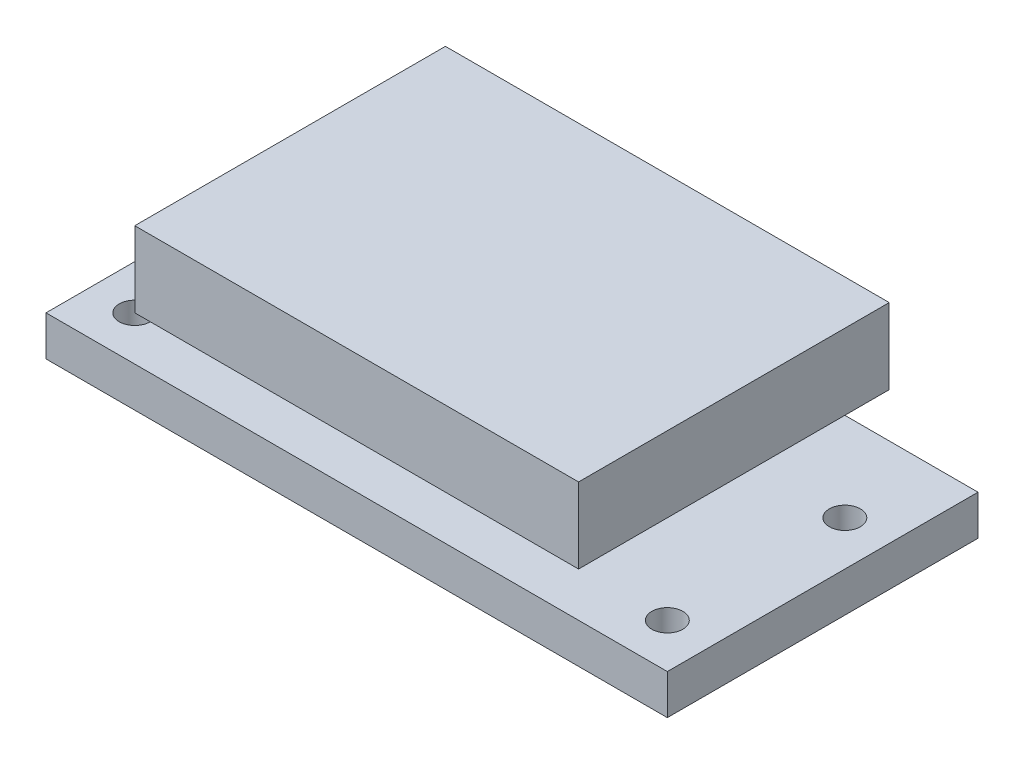
ISO-10303-21;
HEADER;
FILE_DESCRIPTION(('STEP AP214'),'2;1');
FILE_NAME('part.step','',(''),(''),'','','');
FILE_SCHEMA(('AUTOMOTIVE_DESIGN { 1 0 10303 214 1 1 1 1 }'));
ENDSEC;
DATA;
#1=APPLICATION_CONTEXT('core data for automotive mechanical design processes');
#2=APPLICATION_PROTOCOL_DEFINITION('international standard','automotive_design',2000,#1);
#3=PRODUCT_CONTEXT('',#1,'mechanical');
#4=PRODUCT('Part','Part','',(#3));
#5=PRODUCT_RELATED_PRODUCT_CATEGORY('part','',(#4));
#6=PRODUCT_DEFINITION_FORMATION('','',#4);
#7=PRODUCT_DEFINITION_CONTEXT('part definition',#1,'design');
#8=PRODUCT_DEFINITION('design','',#6,#7);
#9=PRODUCT_DEFINITION_SHAPE('','',#8);
#10=(LENGTH_UNIT() NAMED_UNIT(*) SI_UNIT(.MILLI.,.METRE.));
#11=(NAMED_UNIT(*) PLANE_ANGLE_UNIT() SI_UNIT($,.RADIAN.));
#12=(NAMED_UNIT(*) SI_UNIT($,.STERADIAN.) SOLID_ANGLE_UNIT());
#13=UNCERTAINTY_MEASURE_WITH_UNIT(LENGTH_MEASURE(1.E-05),#10,'distance_accuracy_value','');
#14=(GEOMETRIC_REPRESENTATION_CONTEXT(3) GLOBAL_UNCERTAINTY_ASSIGNED_CONTEXT((#13)) GLOBAL_UNIT_ASSIGNED_CONTEXT((#10,
#11,#12)) REPRESENTATION_CONTEXT('',''));
#15=CARTESIAN_POINT('',(0.,0.,0.));
#16=DIRECTION('',(0.,0.,1.));
#17=DIRECTION('',(1.,0.,0.));
#18=AXIS2_PLACEMENT_3D('',#15,#16,#17);
#19=CARTESIAN_POINT('',(25.,18.,-17.5));
#20=DIRECTION('',(-1.,0.,0.));
#21=DIRECTION('',(0.,0.,1.));
#22=AXIS2_PLACEMENT_3D('',#19,#20,#21);
#23=PLANE('',#22);
#24=DIRECTION('',(0.,0.,-1.));
#25=VECTOR('',#24,1.);
#26=CARTESIAN_POINT('',(25.,9.5,-17.5));
#27=LINE('',#26,#25);
#28=CARTESIAN_POINT('',(25.,9.5,17.5));
#29=VERTEX_POINT('',#28);
#30=CARTESIAN_POINT('',(25.,9.5,-17.5));
#31=VERTEX_POINT('',#30);
#32=EDGE_CURVE('E121',#29,#31,#27,.T.);
#33=ORIENTED_EDGE('',*,*,#32,.T.);
#34=DIRECTION('',(0.,-1.,0.));
#35=VECTOR('',#34,1.);
#36=CARTESIAN_POINT('',(25.,18.,-17.5));
#37=LINE('',#36,#35);
#38=CARTESIAN_POINT('',(25.,18.,-17.5));
#39=VERTEX_POINT('',#38);
#40=EDGE_CURVE('E12',#39,#31,#37,.T.);
#41=ORIENTED_EDGE('',*,*,#40,.F.);
#42=DIRECTION('',(0.,0.,-1.));
#43=VECTOR('',#42,1.);
#44=CARTESIAN_POINT('',(25.,18.,-17.5));
#45=LINE('',#44,#43);
#46=CARTESIAN_POINT('',(25.,18.,17.5));
#47=VERTEX_POINT('',#46);
#48=EDGE_CURVE('E105',#47,#39,#45,.T.);
#49=ORIENTED_EDGE('',*,*,#48,.F.);
#50=DIRECTION('',(0.,-1.,0.));
#51=VECTOR('',#50,1.);
#52=CARTESIAN_POINT('',(25.,18.,17.5));
#53=LINE('',#52,#51);
#54=EDGE_CURVE('E117',#47,#29,#53,.T.);
#55=ORIENTED_EDGE('',*,*,#54,.T.);
#56=EDGE_LOOP('',(#33,#41,#49,#55));
#57=FACE_BOUND('',#56,.T.);
#58=ADVANCED_FACE('F53',(#57),#23,.F.);
#59=CARTESIAN_POINT('',(-25.,18.,-17.5));
#60=DIRECTION('',(0.,0.,1.));
#61=DIRECTION('',(1.,0.,0.));
#62=AXIS2_PLACEMENT_3D('',#59,#60,#61);
#63=PLANE('',#62);
#64=DIRECTION('',(-1.,0.,0.));
#65=VECTOR('',#64,1.);
#66=CARTESIAN_POINT('',(-25.,9.5,-17.5));
#67=LINE('',#66,#65);
#68=CARTESIAN_POINT('',(-25.,9.5,-17.5));
#69=VERTEX_POINT('',#68);
#70=EDGE_CURVE('E110',#31,#69,#67,.T.);
#71=ORIENTED_EDGE('',*,*,#70,.T.);
#72=DIRECTION('',(0.,-1.,0.));
#73=VECTOR('',#72,1.);
#74=CARTESIAN_POINT('',(-25.,18.,-17.5));
#75=LINE('',#74,#73);
#76=CARTESIAN_POINT('',(-25.,18.,-17.5));
#77=VERTEX_POINT('',#76);
#78=EDGE_CURVE('E62',#77,#69,#75,.T.);
#79=ORIENTED_EDGE('',*,*,#78,.F.);
#80=DIRECTION('',(-1.,0.,0.));
#81=VECTOR('',#80,1.);
#82=CARTESIAN_POINT('',(-25.,18.,-17.5));
#83=LINE('',#82,#81);
#84=EDGE_CURVE('E100',#39,#77,#83,.T.);
#85=ORIENTED_EDGE('',*,*,#84,.F.);
#86=ORIENTED_EDGE('',*,*,#40,.T.);
#87=EDGE_LOOP('',(#71,#79,#85,#86));
#88=FACE_BOUND('',#87,.T.);
#89=ADVANCED_FACE('F109',(#88),#63,.F.);
#90=CARTESIAN_POINT('',(-25.,18.,-17.5));
#91=DIRECTION('',(1.,0.,0.));
#92=DIRECTION('',(0.,0.,-1.));
#93=AXIS2_PLACEMENT_3D('',#90,#91,#92);
#94=PLANE('',#93);
#95=DIRECTION('',(0.,0.,1.));
#96=VECTOR('',#95,1.);
#97=CARTESIAN_POINT('',(-25.,9.5,-17.5));
#98=LINE('',#97,#96);
#99=CARTESIAN_POINT('',(-25.,9.5,17.5));
#100=VERTEX_POINT('',#99);
#101=EDGE_CURVE('E87',#69,#100,#98,.T.);
#102=ORIENTED_EDGE('',*,*,#101,.T.);
#103=DIRECTION('',(0.,-1.,0.));
#104=VECTOR('',#103,1.);
#105=CARTESIAN_POINT('',(-25.,18.,17.5));
#106=LINE('',#105,#104);
#107=CARTESIAN_POINT('',(-25.,18.,17.5));
#108=VERTEX_POINT('',#107);
#109=EDGE_CURVE('E112',#108,#100,#106,.T.);
#110=ORIENTED_EDGE('',*,*,#109,.F.);
#111=DIRECTION('',(0.,0.,1.));
#112=VECTOR('',#111,1.);
#113=CARTESIAN_POINT('',(-25.,18.,-17.5));
#114=LINE('',#113,#112);
#115=EDGE_CURVE('E103',#77,#108,#114,.T.);
#116=ORIENTED_EDGE('',*,*,#115,.F.);
#117=ORIENTED_EDGE('',*,*,#78,.T.);
#118=EDGE_LOOP('',(#102,#110,#116,#117));
#119=FACE_BOUND('',#118,.T.);
#120=ADVANCED_FACE('F113',(#119),#94,.F.);
#121=CARTESIAN_POINT('',(-25.,18.,17.5));
#122=DIRECTION('',(0.,0.,-1.));
#123=DIRECTION('',(-1.,0.,0.));
#124=AXIS2_PLACEMENT_3D('',#121,#122,#123);
#125=PLANE('',#124);
#126=DIRECTION('',(1.,0.,0.));
#127=VECTOR('',#126,1.);
#128=CARTESIAN_POINT('',(-25.,9.5,17.5));
#129=LINE('',#128,#127);
#130=EDGE_CURVE('E93',#100,#29,#129,.T.);
#131=ORIENTED_EDGE('',*,*,#130,.T.);
#132=ORIENTED_EDGE('',*,*,#54,.F.);
#133=DIRECTION('',(1.,0.,0.));
#134=VECTOR('',#133,1.);
#135=CARTESIAN_POINT('',(-25.,18.,17.5));
#136=LINE('',#135,#134);
#137=EDGE_CURVE('E70',#108,#47,#136,.T.);
#138=ORIENTED_EDGE('',*,*,#137,.F.);
#139=ORIENTED_EDGE('',*,*,#109,.T.);
#140=EDGE_LOOP('',(#131,#132,#138,#139));
#141=FACE_BOUND('',#140,.T.);
#142=ADVANCED_FACE('F134',(#141),#125,.F.);
#143=CARTESIAN_POINT('',(0.,18.,0.));
#144=DIRECTION('',(0.,1.,0.));
#145=DIRECTION('',(0.,0.,1.));
#146=AXIS2_PLACEMENT_3D('',#143,#144,#145);
#147=PLANE('',#146);
#148=ORIENTED_EDGE('',*,*,#48,.T.);
#149=ORIENTED_EDGE('',*,*,#84,.T.);
#150=ORIENTED_EDGE('',*,*,#115,.T.);
#151=ORIENTED_EDGE('',*,*,#137,.T.);
#152=EDGE_LOOP('',(#148,#149,#150,#151));
#153=FACE_BOUND('',#152,.T.);
#154=ADVANCED_FACE('F101',(#153),#147,.T.);
#155=CARTESIAN_POINT('',(0.,9.5,0.));
#156=DIRECTION('',(0.,1.,0.));
#157=DIRECTION('',(0.,0.,1.));
#158=AXIS2_PLACEMENT_3D('',#155,#156,#157);
#159=PLANE('',#158);
#160=ORIENTED_EDGE('',*,*,#32,.F.);
#161=ORIENTED_EDGE('',*,*,#130,.F.);
#162=ORIENTED_EDGE('',*,*,#101,.F.);
#163=ORIENTED_EDGE('',*,*,#70,.F.);
#164=EDGE_LOOP('',(#160,#161,#162,#163));
#165=FACE_BOUND('',#164,.T.);
#166=ADVANCED_FACE('F137',(#165),#159,.F.);
#167=CLOSED_SHELL('',(#58,#89,#120,#142,#154,#166));
#168=MANIFOLD_SOLID_BREP('B2',#167);
#169=CARTESIAN_POINT('',(0.,4.5,0.));
#170=DIRECTION('',(0.,1.,0.));
#171=DIRECTION('',(0.,0.,1.));
#172=AXIS2_PLACEMENT_3D('',#169,#170,#171);
#173=PLANE('',#172);
#174=CARTESIAN_POINT('',(30.0000000000006,4.5,12.4999999999943));
#175=DIRECTION('',(0.,1.,0.));
#176=DIRECTION('',(0.,0.,1.));
#177=AXIS2_PLACEMENT_3D('',#174,#175,#176);
#178=CIRCLE('',#177,1.75);
#179=CARTESIAN_POINT('',(30.0000000000006,4.5,14.2499999999943));
#180=VERTEX_POINT('',#179);
#181=EDGE_CURVE('E289',#180,#180,#178,.T.);
#182=ORIENTED_EDGE('',*,*,#181,.F.);
#183=EDGE_LOOP('',(#182));
#184=FACE_BOUND('',#183,.T.);
#185=CARTESIAN_POINT('',(-30.0000000000006,4.5,-7.49999999999659));
#186=DIRECTION('',(0.,1.,0.));
#187=DIRECTION('',(0.,0.,1.));
#188=AXIS2_PLACEMENT_3D('',#185,#186,#187);
#189=CIRCLE('',#188,1.75);
#190=CARTESIAN_POINT('',(-30.0000000000006,4.5,-5.74999999999659));
#191=VERTEX_POINT('',#190);
#192=EDGE_CURVE('E268',#191,#191,#189,.T.);
#193=ORIENTED_EDGE('',*,*,#192,.F.);
#194=EDGE_LOOP('',(#193));
#195=FACE_BOUND('',#194,.T.);
#196=DIRECTION('',(0.,0.,-1.));
#197=VECTOR('',#196,1.);
#198=CARTESIAN_POINT('',(35.,4.5,-17.5));
#199=LINE('',#198,#197);
#200=CARTESIAN_POINT('',(35.,4.5,17.5));
#201=VERTEX_POINT('',#200);
#202=CARTESIAN_POINT('',(35.,4.5,-17.5));
#203=VERTEX_POINT('',#202);
#204=EDGE_CURVE('E253',#201,#203,#199,.T.);
#205=ORIENTED_EDGE('',*,*,#204,.T.);
#206=DIRECTION('',(-1.,0.,0.));
#207=VECTOR('',#206,1.);
#208=CARTESIAN_POINT('',(-35.,4.5,-17.5));
#209=LINE('',#208,#207);
#210=CARTESIAN_POINT('',(-35.,4.5,-17.5));
#211=VERTEX_POINT('',#210);
#212=EDGE_CURVE('E248',#203,#211,#209,.T.);
#213=ORIENTED_EDGE('',*,*,#212,.T.);
#214=DIRECTION('',(0.,0.,1.));
#215=VECTOR('',#214,1.);
#216=CARTESIAN_POINT('',(-35.,4.5,-17.5));
#217=LINE('',#216,#215);
#218=CARTESIAN_POINT('',(-35.,4.5,17.5));
#219=VERTEX_POINT('',#218);
#220=EDGE_CURVE('E251',#211,#219,#217,.T.);
#221=ORIENTED_EDGE('',*,*,#220,.T.);
#222=DIRECTION('',(1.,0.,0.));
#223=VECTOR('',#222,1.);
#224=CARTESIAN_POINT('',(-35.,4.5,17.5));
#225=LINE('',#224,#223);
#226=EDGE_CURVE('E218',#219,#201,#225,.T.);
#227=ORIENTED_EDGE('',*,*,#226,.T.);
#228=EDGE_LOOP('',(#205,#213,#221,#227));
#229=FACE_BOUND('',#228,.T.);
#230=CARTESIAN_POINT('',(30.0000000000006,4.5,-7.49999999999659));
#231=DIRECTION('',(0.,1.,0.));
#232=DIRECTION('',(0.,0.,1.));
#233=AXIS2_PLACEMENT_3D('',#230,#231,#232);
#234=CIRCLE('',#233,1.75);
#235=CARTESIAN_POINT('',(30.0000000000006,4.5,-5.74999999999659));
#236=VERTEX_POINT('',#235);
#237=EDGE_CURVE('E283',#236,#236,#234,.T.);
#238=ORIENTED_EDGE('',*,*,#237,.F.);
#239=EDGE_LOOP('',(#238));
#240=FACE_BOUND('',#239,.T.);
#241=CARTESIAN_POINT('',(-30.0000000000006,4.5,12.4999999999943));
#242=DIRECTION('',(0.,1.,0.));
#243=DIRECTION('',(0.,0.,1.));
#244=AXIS2_PLACEMENT_3D('',#241,#242,#243);
#245=CIRCLE('',#244,1.75);
#246=CARTESIAN_POINT('',(-30.0000000000006,4.5,14.2499999999943));
#247=VERTEX_POINT('',#246);
#248=EDGE_CURVE('E295',#247,#247,#245,.T.);
#249=ORIENTED_EDGE('',*,*,#248,.F.);
#250=EDGE_LOOP('',(#249));
#251=FACE_BOUND('',#250,.T.);
#252=ADVANCED_FACE('F201',(#184,#195,#229,#240,#251),#173,.T.);
#253=CARTESIAN_POINT('',(0.,0.,0.));
#254=DIRECTION('',(0.,1.,0.));
#255=DIRECTION('',(0.,0.,1.));
#256=AXIS2_PLACEMENT_3D('',#253,#254,#255);
#257=PLANE('',#256);
#258=DIRECTION('',(0.,0.,-1.));
#259=VECTOR('',#258,1.);
#260=CARTESIAN_POINT('',(35.,0.,-17.5));
#261=LINE('',#260,#259);
#262=CARTESIAN_POINT('',(35.,0.,17.5));
#263=VERTEX_POINT('',#262);
#264=CARTESIAN_POINT('',(35.,0.,-17.5));
#265=VERTEX_POINT('',#264);
#266=EDGE_CURVE('E265',#263,#265,#261,.T.);
#267=ORIENTED_EDGE('',*,*,#266,.F.);
#268=DIRECTION('',(1.,0.,0.));
#269=VECTOR('',#268,1.);
#270=CARTESIAN_POINT('',(-35.,0.,17.5));
#271=LINE('',#270,#269);
#272=CARTESIAN_POINT('',(-35.,0.,17.5));
#273=VERTEX_POINT('',#272);
#274=EDGE_CURVE('E241',#273,#263,#271,.T.);
#275=ORIENTED_EDGE('',*,*,#274,.F.);
#276=DIRECTION('',(0.,0.,1.));
#277=VECTOR('',#276,1.);
#278=CARTESIAN_POINT('',(-35.,0.,-17.5));
#279=LINE('',#278,#277);
#280=CARTESIAN_POINT('',(-35.,0.,-17.5));
#281=VERTEX_POINT('',#280);
#282=EDGE_CURVE('E235',#281,#273,#279,.T.);
#283=ORIENTED_EDGE('',*,*,#282,.F.);
#284=DIRECTION('',(-1.,0.,0.));
#285=VECTOR('',#284,1.);
#286=CARTESIAN_POINT('',(-35.,0.,-17.5));
#287=LINE('',#286,#285);
#288=EDGE_CURVE('E257',#265,#281,#287,.T.);
#289=ORIENTED_EDGE('',*,*,#288,.F.);
#290=EDGE_LOOP('',(#267,#275,#283,#289));
#291=FACE_BOUND('',#290,.T.);
#292=CARTESIAN_POINT('',(-30.0000000000006,0.,-7.49999999999659));
#293=DIRECTION('',(0.,1.,0.));
#294=DIRECTION('',(0.,0.,1.));
#295=AXIS2_PLACEMENT_3D('',#292,#293,#294);
#296=CIRCLE('',#295,1.75);
#297=CARTESIAN_POINT('',(-30.0000000000006,0.,-5.74999999999659));
#298=VERTEX_POINT('',#297);
#299=EDGE_CURVE('E280',#298,#298,#296,.T.);
#300=ORIENTED_EDGE('',*,*,#299,.T.);
#301=EDGE_LOOP('',(#300));
#302=FACE_BOUND('',#301,.T.);
#303=CARTESIAN_POINT('',(30.0000000000006,0.,-7.49999999999659));
#304=DIRECTION('',(0.,1.,0.));
#305=DIRECTION('',(0.,0.,1.));
#306=AXIS2_PLACEMENT_3D('',#303,#304,#305);
#307=CIRCLE('',#306,1.75);
#308=CARTESIAN_POINT('',(30.0000000000006,0.,-5.74999999999659));
#309=VERTEX_POINT('',#308);
#310=EDGE_CURVE('E286',#309,#309,#307,.T.);
#311=ORIENTED_EDGE('',*,*,#310,.T.);
#312=EDGE_LOOP('',(#311));
#313=FACE_BOUND('',#312,.T.);
#314=CARTESIAN_POINT('',(30.0000000000006,0.,12.4999999999943));
#315=DIRECTION('',(0.,1.,0.));
#316=DIRECTION('',(0.,0.,1.));
#317=AXIS2_PLACEMENT_3D('',#314,#315,#316);
#318=CIRCLE('',#317,1.75);
#319=CARTESIAN_POINT('',(30.0000000000006,0.,14.2499999999943));
#320=VERTEX_POINT('',#319);
#321=EDGE_CURVE('E292',#320,#320,#318,.T.);
#322=ORIENTED_EDGE('',*,*,#321,.T.);
#323=EDGE_LOOP('',(#322));
#324=FACE_BOUND('',#323,.T.);
#325=CARTESIAN_POINT('',(-30.0000000000006,0.,12.4999999999943));
#326=DIRECTION('',(0.,1.,0.));
#327=DIRECTION('',(0.,0.,1.));
#328=AXIS2_PLACEMENT_3D('',#325,#326,#327);
#329=CIRCLE('',#328,1.75);
#330=CARTESIAN_POINT('',(-30.0000000000006,0.,14.2499999999943));
#331=VERTEX_POINT('',#330);
#332=EDGE_CURVE('E298',#331,#331,#329,.T.);
#333=ORIENTED_EDGE('',*,*,#332,.T.);
#334=EDGE_LOOP('',(#333));
#335=FACE_BOUND('',#334,.T.);
#336=ADVANCED_FACE('F276',(#291,#302,#313,#324,#335),#257,.F.);
#337=CARTESIAN_POINT('',(35.,4.5,-17.5));
#338=DIRECTION('',(-1.,0.,0.));
#339=DIRECTION('',(0.,0.,1.));
#340=AXIS2_PLACEMENT_3D('',#337,#338,#339);
#341=PLANE('',#340);
#342=ORIENTED_EDGE('',*,*,#266,.T.);
#343=DIRECTION('',(0.,-1.,0.));
#344=VECTOR('',#343,1.);
#345=CARTESIAN_POINT('',(35.,4.5,-17.5));
#346=LINE('',#345,#344);
#347=EDGE_CURVE('E51',#203,#265,#346,.T.);
#348=ORIENTED_EDGE('',*,*,#347,.F.);
#349=ORIENTED_EDGE('',*,*,#204,.F.);
#350=DIRECTION('',(0.,-1.,0.));
#351=VECTOR('',#350,1.);
#352=CARTESIAN_POINT('',(35.,4.5,17.5));
#353=LINE('',#352,#351);
#354=EDGE_CURVE('E261',#201,#263,#353,.T.);
#355=ORIENTED_EDGE('',*,*,#354,.T.);
#356=EDGE_LOOP('',(#342,#348,#349,#355));
#357=FACE_BOUND('',#356,.T.);
#358=ADVANCED_FACE('F203',(#357),#341,.F.);
#359=CARTESIAN_POINT('',(-35.,4.5,-17.5));
#360=DIRECTION('',(0.,0.,1.));
#361=DIRECTION('',(1.,0.,0.));
#362=AXIS2_PLACEMENT_3D('',#359,#360,#361);
#363=PLANE('',#362);
#364=ORIENTED_EDGE('',*,*,#288,.T.);
#365=DIRECTION('',(0.,-1.,0.));
#366=VECTOR('',#365,1.);
#367=CARTESIAN_POINT('',(-35.,4.5,-17.5));
#368=LINE('',#367,#366);
#369=EDGE_CURVE('E210',#211,#281,#368,.T.);
#370=ORIENTED_EDGE('',*,*,#369,.F.);
#371=ORIENTED_EDGE('',*,*,#212,.F.);
#372=ORIENTED_EDGE('',*,*,#347,.T.);
#373=EDGE_LOOP('',(#364,#370,#371,#372));
#374=FACE_BOUND('',#373,.T.);
#375=ADVANCED_FACE('F256',(#374),#363,.F.);
#376=CARTESIAN_POINT('',(-35.,4.5,-17.5));
#377=DIRECTION('',(1.,0.,0.));
#378=DIRECTION('',(0.,0.,-1.));
#379=AXIS2_PLACEMENT_3D('',#376,#377,#378);
#380=PLANE('',#379);
#381=ORIENTED_EDGE('',*,*,#282,.T.);
#382=DIRECTION('',(0.,-1.,0.));
#383=VECTOR('',#382,1.);
#384=CARTESIAN_POINT('',(-35.,4.5,17.5));
#385=LINE('',#384,#383);
#386=EDGE_CURVE('E258',#219,#273,#385,.T.);
#387=ORIENTED_EDGE('',*,*,#386,.F.);
#388=ORIENTED_EDGE('',*,*,#220,.F.);
#389=ORIENTED_EDGE('',*,*,#369,.T.);
#390=EDGE_LOOP('',(#381,#387,#388,#389));
#391=FACE_BOUND('',#390,.T.);
#392=ADVANCED_FACE('F259',(#391),#380,.F.);
#393=CARTESIAN_POINT('',(-35.,4.5,17.5));
#394=DIRECTION('',(0.,0.,-1.));
#395=DIRECTION('',(-1.,0.,0.));
#396=AXIS2_PLACEMENT_3D('',#393,#394,#395);
#397=PLANE('',#396);
#398=ORIENTED_EDGE('',*,*,#274,.T.);
#399=ORIENTED_EDGE('',*,*,#354,.F.);
#400=ORIENTED_EDGE('',*,*,#226,.F.);
#401=ORIENTED_EDGE('',*,*,#386,.T.);
#402=EDGE_LOOP('',(#398,#399,#400,#401));
#403=FACE_BOUND('',#402,.T.);
#404=ADVANCED_FACE('F273',(#403),#397,.F.);
#405=CARTESIAN_POINT('',(-30.0000000000006,4.5,-7.49999999999659));
#406=DIRECTION('',(0.,-1.,0.));
#407=DIRECTION('',(0.,0.,-1.));
#408=AXIS2_PLACEMENT_3D('',#405,#406,#407);
#409=CYLINDRICAL_SURFACE('',#408,1.75);
#410=ORIENTED_EDGE('',*,*,#192,.T.);
#411=EDGE_LOOP('',(#410));
#412=FACE_BOUND('',#411,.T.);
#413=ORIENTED_EDGE('',*,*,#299,.F.);
#414=EDGE_LOOP('',(#413));
#415=FACE_BOUND('',#414,.T.);
#416=ADVANCED_FACE('F317',(#412,#415),#409,.F.);
#417=CARTESIAN_POINT('',(30.0000000000006,4.5,-7.49999999999659));
#418=DIRECTION('',(0.,-1.,0.));
#419=DIRECTION('',(0.,0.,-1.));
#420=AXIS2_PLACEMENT_3D('',#417,#418,#419);
#421=CYLINDRICAL_SURFACE('',#420,1.75);
#422=ORIENTED_EDGE('',*,*,#237,.T.);
#423=EDGE_LOOP('',(#422));
#424=FACE_BOUND('',#423,.T.);
#425=ORIENTED_EDGE('',*,*,#310,.F.);
#426=EDGE_LOOP('',(#425));
#427=FACE_BOUND('',#426,.T.);
#428=ADVANCED_FACE('F371',(#424,#427),#421,.F.);
#429=CARTESIAN_POINT('',(30.0000000000006,4.5,12.4999999999943));
#430=DIRECTION('',(0.,-1.,0.));
#431=DIRECTION('',(0.,0.,-1.));
#432=AXIS2_PLACEMENT_3D('',#429,#430,#431);
#433=CYLINDRICAL_SURFACE('',#432,1.75);
#434=ORIENTED_EDGE('',*,*,#181,.T.);
#435=EDGE_LOOP('',(#434));
#436=FACE_BOUND('',#435,.T.);
#437=ORIENTED_EDGE('',*,*,#321,.F.);
#438=EDGE_LOOP('',(#437));
#439=FACE_BOUND('',#438,.T.);
#440=ADVANCED_FACE('F380',(#436,#439),#433,.F.);
#441=CARTESIAN_POINT('',(-30.0000000000006,4.5,12.4999999999943));
#442=DIRECTION('',(0.,-1.,0.));
#443=DIRECTION('',(0.,0.,-1.));
#444=AXIS2_PLACEMENT_3D('',#441,#442,#443);
#445=CYLINDRICAL_SURFACE('',#444,1.75);
#446=ORIENTED_EDGE('',*,*,#248,.T.);
#447=EDGE_LOOP('',(#446));
#448=FACE_BOUND('',#447,.T.);
#449=ORIENTED_EDGE('',*,*,#332,.F.);
#450=EDGE_LOOP('',(#449));
#451=FACE_BOUND('',#450,.T.);
#452=ADVANCED_FACE('F304',(#448,#451),#445,.F.);
#453=CLOSED_SHELL('',(#252,#336,#358,#375,#392,#404,#416,#428,#440,#452));
#454=MANIFOLD_SOLID_BREP('B6',#453);
#455=ADVANCED_BREP_SHAPE_REPRESENTATION('',(#18,#168,#454),#14);
#456=SHAPE_DEFINITION_REPRESENTATION(#9,#455);
ENDSEC;
END-ISO-10303-21;
